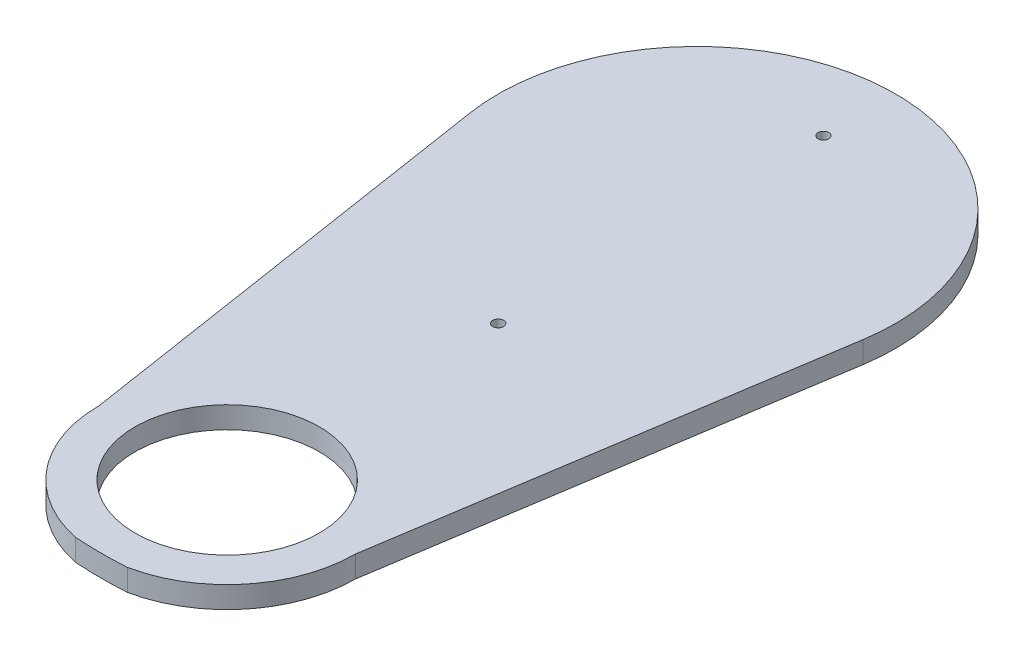
ISO-10303-21;
HEADER;
FILE_DESCRIPTION(('STEP AP214'),'2;1');
FILE_NAME('part.step','',(''),(''),'','','');
FILE_SCHEMA(('AUTOMOTIVE_DESIGN { 1 0 10303 214 1 1 1 1 }'));
ENDSEC;
DATA;
#1=APPLICATION_CONTEXT('core data for automotive mechanical design processes');
#2=APPLICATION_PROTOCOL_DEFINITION('international standard','automotive_design',2000,#1);
#3=PRODUCT_CONTEXT('',#1,'mechanical');
#4=PRODUCT('Part','Part','',(#3));
#5=PRODUCT_RELATED_PRODUCT_CATEGORY('part','',(#4));
#6=PRODUCT_DEFINITION_FORMATION('','',#4);
#7=PRODUCT_DEFINITION_CONTEXT('part definition',#1,'design');
#8=PRODUCT_DEFINITION('design','',#6,#7);
#9=PRODUCT_DEFINITION_SHAPE('','',#8);
#10=(LENGTH_UNIT() NAMED_UNIT(*) SI_UNIT(.MILLI.,.METRE.));
#11=(NAMED_UNIT(*) PLANE_ANGLE_UNIT() SI_UNIT($,.RADIAN.));
#12=(NAMED_UNIT(*) SI_UNIT($,.STERADIAN.) SOLID_ANGLE_UNIT());
#13=UNCERTAINTY_MEASURE_WITH_UNIT(LENGTH_MEASURE(1.E-05),#10,'distance_accuracy_value','');
#14=(GEOMETRIC_REPRESENTATION_CONTEXT(3) GLOBAL_UNCERTAINTY_ASSIGNED_CONTEXT((#13)) GLOBAL_UNIT_ASSIGNED_CONTEXT((#10,
#11,#12)) REPRESENTATION_CONTEXT('',''));
#15=CARTESIAN_POINT('',(0.,0.,0.));
#16=DIRECTION('',(0.,0.,1.));
#17=DIRECTION('',(1.,0.,0.));
#18=AXIS2_PLACEMENT_3D('',#15,#16,#17);
#19=CARTESIAN_POINT('',(0.,6.,0.));
#20=DIRECTION('',(0.,-1.,0.));
#21=DIRECTION('',(0.,0.,-1.));
#22=AXIS2_PLACEMENT_3D('',#19,#20,#21);
#23=CYLINDRICAL_SURFACE('',#22,110.);
#24=DIRECTION('',(0.,1.,0.));
#25=VECTOR('',#24,1.);
#26=CARTESIAN_POINT('',(-7.18642992034292,-4.,109.765));
#27=LINE('',#26,#25);
#28=CARTESIAN_POINT('',(-7.18642992034292,0.,109.765));
#29=VERTEX_POINT('',#28);
#30=CARTESIAN_POINT('',(-7.18642992034292,6.,109.765));
#31=VERTEX_POINT('',#30);
#32=EDGE_CURVE('E126',#29,#31,#27,.T.);
#33=ORIENTED_EDGE('',*,*,#32,.F.);
#34=CARTESIAN_POINT('',(0.,0.,0.));
#35=DIRECTION('',(0.,1.,0.));
#36=DIRECTION('',(0.,0.,1.));
#37=AXIS2_PLACEMENT_3D('',#34,#35,#36);
#38=CIRCLE('',#37,110.);
#39=CARTESIAN_POINT('',(7.18642992034292,0.,109.765));
#40=VERTEX_POINT('',#39);
#41=EDGE_CURVE('E147',#29,#40,#38,.T.);
#42=ORIENTED_EDGE('',*,*,#41,.T.);
#43=DIRECTION('',(0.,1.,0.));
#44=VECTOR('',#43,1.);
#45=CARTESIAN_POINT('',(7.18642992034292,-4.,109.765));
#46=LINE('',#45,#44);
#47=CARTESIAN_POINT('',(7.18642992034292,6.,109.765));
#48=VERTEX_POINT('',#47);
#49=EDGE_CURVE('E144',#40,#48,#46,.T.);
#50=ORIENTED_EDGE('',*,*,#49,.T.);
#51=CARTESIAN_POINT('',(0.,6.,0.));
#52=DIRECTION('',(0.,1.,0.));
#53=DIRECTION('',(0.,0.,1.));
#54=AXIS2_PLACEMENT_3D('',#51,#52,#53);
#55=CIRCLE('',#54,110.);
#56=EDGE_CURVE('E151',#31,#48,#55,.T.);
#57=ORIENTED_EDGE('',*,*,#56,.F.);
#58=EDGE_LOOP('',(#33,#42,#50,#57));
#59=FACE_BOUND('',#58,.T.);
#60=ADVANCED_FACE('F59',(#59),#23,.T.);
#61=CARTESIAN_POINT('',(0.,6.,0.));
#62=DIRECTION('',(0.,1.,0.));
#63=DIRECTION('',(0.,0.,1.));
#64=AXIS2_PLACEMENT_3D('',#61,#62,#63);
#65=PLANE('',#64);
#66=CARTESIAN_POINT('',(0.,6.,-90.));
#67=DIRECTION('',(0.,1.,0.));
#68=DIRECTION('',(0.,0.,1.));
#69=AXIS2_PLACEMENT_3D('',#66,#67,#68);
#70=CIRCLE('',#69,1.5);
#71=CARTESIAN_POINT('',(0.,6.,-88.5));
#72=VERTEX_POINT('',#71);
#73=EDGE_CURVE('E153',#72,#72,#70,.T.);
#74=ORIENTED_EDGE('',*,*,#73,.F.);
#75=EDGE_LOOP('',(#74));
#76=FACE_BOUND('',#75,.T.);
#77=CARTESIAN_POINT('',(0.,6.,0.));
#78=DIRECTION('',(0.,1.,0.));
#79=DIRECTION('',(0.,0.,1.));
#80=AXIS2_PLACEMENT_3D('',#77,#78,#79);
#81=CIRCLE('',#80,1.5);
#82=CARTESIAN_POINT('',(0.,6.,1.5));
#83=VERTEX_POINT('',#82);
#84=EDGE_CURVE('E157',#83,#83,#81,.T.);
#85=ORIENTED_EDGE('',*,*,#84,.F.);
#86=EDGE_LOOP('',(#85));
#87=FACE_BOUND('',#86,.T.);
#88=CARTESIAN_POINT('',(0.,6.,75.));
#89=DIRECTION('',(0.,1.,0.));
#90=DIRECTION('',(0.,0.,1.));
#91=AXIS2_PLACEMENT_3D('',#88,#89,#90);
#92=CIRCLE('',#91,25.5);
#93=CARTESIAN_POINT('',(0.,6.,100.5));
#94=VERTEX_POINT('',#93);
#95=EDGE_CURVE('E160',#94,#94,#92,.T.);
#96=ORIENTED_EDGE('',*,*,#95,.F.);
#97=EDGE_LOOP('',(#96));
#98=FACE_BOUND('',#97,.T.);
#99=DIRECTION('',(-0.153224661677923,0.,-0.988191379770986));
#100=VECTOR('',#99,1.);
#101=CARTESIAN_POINT('',(-46.0226849462896,6.,7.13607756023852));
#102=LINE('',#101,#100);
#103=CARTESIAN_POINT('',(-35.5,6.,75.));
#104=VERTEX_POINT('',#103);
#105=CARTESIAN_POINT('',(-54.3505258874043,6.,-46.5726436077142));
#106=VERTEX_POINT('',#105);
#107=EDGE_CURVE('E116',#104,#106,#102,.T.);
#108=ORIENTED_EDGE('',*,*,#107,.F.);
#109=CARTESIAN_POINT('',(0.,6.,75.));
#110=DIRECTION('',(0.,1.,0.));
#111=DIRECTION('',(0.,0.,1.));
#112=AXIS2_PLACEMENT_3D('',#109,#110,#111);
#113=CIRCLE('',#112,35.5);
#114=EDGE_CURVE('E123',#104,#31,#113,.T.);
#115=ORIENTED_EDGE('',*,*,#114,.T.);
#116=ORIENTED_EDGE('',*,*,#56,.T.);
#117=CARTESIAN_POINT('',(0.,6.,75.));
#118=DIRECTION('',(0.,1.,0.));
#119=DIRECTION('',(0.,0.,1.));
#120=AXIS2_PLACEMENT_3D('',#117,#118,#119);
#121=CIRCLE('',#120,35.5);
#122=CARTESIAN_POINT('',(35.5,6.,75.));
#123=VERTEX_POINT('',#122);
#124=EDGE_CURVE('E137',#48,#123,#121,.T.);
#125=ORIENTED_EDGE('',*,*,#124,.T.);
#126=DIRECTION('',(0.153224661677923,0.,-0.988191379770986));
#127=VECTOR('',#126,1.);
#128=CARTESIAN_POINT('',(46.0226849462896,6.,7.13607756023851));
#129=LINE('',#128,#127);
#130=CARTESIAN_POINT('',(54.3505258874043,6.,-46.5726436077142));
#131=VERTEX_POINT('',#130);
#132=EDGE_CURVE('E142',#123,#131,#129,.T.);
#133=ORIENTED_EDGE('',*,*,#132,.T.);
#134=CARTESIAN_POINT('',(0.,6.,-55.));
#135=DIRECTION('',(0.,1.,0.));
#136=DIRECTION('',(0.,0.,1.));
#137=AXIS2_PLACEMENT_3D('',#134,#135,#136);
#138=CIRCLE('',#137,55.);
#139=EDGE_CURVE('E132',#131,#106,#138,.T.);
#140=ORIENTED_EDGE('',*,*,#139,.T.);
#141=EDGE_LOOP('',(#108,#115,#116,#125,#133,#140));
#142=FACE_BOUND('',#141,.T.);
#143=ADVANCED_FACE('F130',(#76,#87,#98,#142),#65,.T.);
#144=CARTESIAN_POINT('',(0.,0.,0.));
#145=DIRECTION('',(0.,1.,0.));
#146=DIRECTION('',(0.,0.,1.));
#147=AXIS2_PLACEMENT_3D('',#144,#145,#146);
#148=PLANE('',#147);
#149=CARTESIAN_POINT('',(0.,0.,-90.));
#150=DIRECTION('',(0.,1.,0.));
#151=DIRECTION('',(0.,0.,1.));
#152=AXIS2_PLACEMENT_3D('',#149,#150,#151);
#153=CIRCLE('',#152,1.5);
#154=CARTESIAN_POINT('',(0.,0.,-88.5));
#155=VERTEX_POINT('',#154);
#156=EDGE_CURVE('E165',#155,#155,#153,.T.);
#157=ORIENTED_EDGE('',*,*,#156,.T.);
#158=EDGE_LOOP('',(#157));
#159=FACE_BOUND('',#158,.T.);
#160=CARTESIAN_POINT('',(0.,0.,0.));
#161=DIRECTION('',(0.,1.,0.));
#162=DIRECTION('',(0.,0.,1.));
#163=AXIS2_PLACEMENT_3D('',#160,#161,#162);
#164=CIRCLE('',#163,1.5);
#165=CARTESIAN_POINT('',(0.,0.,1.5));
#166=VERTEX_POINT('',#165);
#167=EDGE_CURVE('E168',#166,#166,#164,.T.);
#168=ORIENTED_EDGE('',*,*,#167,.T.);
#169=EDGE_LOOP('',(#168));
#170=FACE_BOUND('',#169,.T.);
#171=CARTESIAN_POINT('',(0.,0.,75.));
#172=DIRECTION('',(0.,1.,0.));
#173=DIRECTION('',(0.,0.,1.));
#174=AXIS2_PLACEMENT_3D('',#171,#172,#173);
#175=CIRCLE('',#174,25.5);
#176=CARTESIAN_POINT('',(0.,0.,100.5));
#177=VERTEX_POINT('',#176);
#178=EDGE_CURVE('E154',#177,#177,#175,.T.);
#179=ORIENTED_EDGE('',*,*,#178,.T.);
#180=EDGE_LOOP('',(#179));
#181=FACE_BOUND('',#180,.T.);
#182=CARTESIAN_POINT('',(0.,0.,75.));
#183=DIRECTION('',(0.,1.,0.));
#184=DIRECTION('',(0.,0.,1.));
#185=AXIS2_PLACEMENT_3D('',#182,#183,#184);
#186=CIRCLE('',#185,35.5);
#187=CARTESIAN_POINT('',(-35.5,0.,75.));
#188=VERTEX_POINT('',#187);
#189=EDGE_CURVE('E12',#188,#29,#186,.T.);
#190=ORIENTED_EDGE('',*,*,#189,.F.);
#191=DIRECTION('',(-0.153224661677923,0.,-0.988191379770986));
#192=VECTOR('',#191,1.);
#193=CARTESIAN_POINT('',(-46.0226849462896,0.,7.13607756023852));
#194=LINE('',#193,#192);
#195=CARTESIAN_POINT('',(-54.3505258874043,0.,-46.5726436077142));
#196=VERTEX_POINT('',#195);
#197=EDGE_CURVE('E66',#188,#196,#194,.T.);
#198=ORIENTED_EDGE('',*,*,#197,.T.);
#199=CARTESIAN_POINT('',(0.,0.,-55.));
#200=DIRECTION('',(0.,1.,0.));
#201=DIRECTION('',(0.,0.,1.));
#202=AXIS2_PLACEMENT_3D('',#199,#200,#201);
#203=CIRCLE('',#202,55.);
#204=CARTESIAN_POINT('',(54.3505258874043,0.,-46.5726436077142));
#205=VERTEX_POINT('',#204);
#206=EDGE_CURVE('E163',#205,#196,#203,.T.);
#207=ORIENTED_EDGE('',*,*,#206,.F.);
#208=DIRECTION('',(0.153224661677923,0.,-0.988191379770986));
#209=VECTOR('',#208,1.);
#210=CARTESIAN_POINT('',(46.0226849462896,0.,7.13607756023851));
#211=LINE('',#210,#209);
#212=CARTESIAN_POINT('',(35.5,0.,75.));
#213=VERTEX_POINT('',#212);
#214=EDGE_CURVE('E174',#213,#205,#211,.T.);
#215=ORIENTED_EDGE('',*,*,#214,.F.);
#216=CARTESIAN_POINT('',(0.,0.,75.));
#217=DIRECTION('',(0.,1.,0.));
#218=DIRECTION('',(0.,0.,1.));
#219=AXIS2_PLACEMENT_3D('',#216,#217,#218);
#220=CIRCLE('',#219,35.5);
#221=EDGE_CURVE('E81',#40,#213,#220,.T.);
#222=ORIENTED_EDGE('',*,*,#221,.F.);
#223=ORIENTED_EDGE('',*,*,#41,.F.);
#224=EDGE_LOOP('',(#190,#198,#207,#215,#222,#223));
#225=FACE_BOUND('',#224,.T.);
#226=ADVANCED_FACE('F178',(#159,#170,#181,#225),#148,.F.);
#227=CARTESIAN_POINT('',(0.,6.,0.));
#228=DIRECTION('',(0.,-1.,0.));
#229=DIRECTION('',(0.,0.,-1.));
#230=AXIS2_PLACEMENT_3D('',#227,#228,#229);
#231=CYLINDRICAL_SURFACE('',#230,1.5);
#232=ORIENTED_EDGE('',*,*,#84,.T.);
#233=EDGE_LOOP('',(#232));
#234=FACE_BOUND('',#233,.T.);
#235=ORIENTED_EDGE('',*,*,#167,.F.);
#236=EDGE_LOOP('',(#235));
#237=FACE_BOUND('',#236,.T.);
#238=ADVANCED_FACE('F206',(#234,#237),#231,.F.);
#239=CARTESIAN_POINT('',(0.,6.,-90.));
#240=DIRECTION('',(0.,-1.,0.));
#241=DIRECTION('',(0.,0.,-1.));
#242=AXIS2_PLACEMENT_3D('',#239,#240,#241);
#243=CYLINDRICAL_SURFACE('',#242,1.5);
#244=ORIENTED_EDGE('',*,*,#73,.T.);
#245=EDGE_LOOP('',(#244));
#246=FACE_BOUND('',#245,.T.);
#247=ORIENTED_EDGE('',*,*,#156,.F.);
#248=EDGE_LOOP('',(#247));
#249=FACE_BOUND('',#248,.T.);
#250=ADVANCED_FACE('F215',(#246,#249),#243,.F.);
#251=CARTESIAN_POINT('',(0.,6.,75.));
#252=DIRECTION('',(0.,-1.,0.));
#253=DIRECTION('',(0.,0.,-1.));
#254=AXIS2_PLACEMENT_3D('',#251,#252,#253);
#255=CYLINDRICAL_SURFACE('',#254,25.5);
#256=ORIENTED_EDGE('',*,*,#95,.T.);
#257=EDGE_LOOP('',(#256));
#258=FACE_BOUND('',#257,.T.);
#259=ORIENTED_EDGE('',*,*,#178,.F.);
#260=EDGE_LOOP('',(#259));
#261=FACE_BOUND('',#260,.T.);
#262=ADVANCED_FACE('F212',(#258,#261),#255,.F.);
#263=CARTESIAN_POINT('',(0.,-4.,75.));
#264=DIRECTION('',(0.,1.,0.));
#265=DIRECTION('',(0.,0.,1.));
#266=AXIS2_PLACEMENT_3D('',#263,#264,#265);
#267=CYLINDRICAL_SURFACE('',#266,35.5);
#268=ORIENTED_EDGE('',*,*,#221,.T.);
#269=DIRECTION('',(0.,1.,0.));
#270=VECTOR('',#269,1.);
#271=CARTESIAN_POINT('',(35.5,-4.,75.));
#272=LINE('',#271,#270);
#273=EDGE_CURVE('E145',#213,#123,#272,.T.);
#274=ORIENTED_EDGE('',*,*,#273,.T.);
#275=ORIENTED_EDGE('',*,*,#124,.F.);
#276=ORIENTED_EDGE('',*,*,#49,.F.);
#277=EDGE_LOOP('',(#268,#274,#275,#276));
#278=FACE_BOUND('',#277,.T.);
#279=ADVANCED_FACE('F183',(#278),#267,.T.);
#280=CARTESIAN_POINT('',(46.0226849462896,-4.,7.13607756023851));
#281=DIRECTION('',(0.988191379770986,0.,0.153224661677923));
#282=DIRECTION('',(0.153224661677923,0.,-0.988191379770986));
#283=AXIS2_PLACEMENT_3D('',#280,#281,#282);
#284=PLANE('',#283);
#285=ORIENTED_EDGE('',*,*,#214,.T.);
#286=DIRECTION('',(0.,1.,0.));
#287=VECTOR('',#286,1.);
#288=CARTESIAN_POINT('',(54.3505258874043,-4.,-46.5726436077142));
#289=LINE('',#288,#287);
#290=EDGE_CURVE('E73',#205,#131,#289,.T.);
#291=ORIENTED_EDGE('',*,*,#290,.T.);
#292=ORIENTED_EDGE('',*,*,#132,.F.);
#293=ORIENTED_EDGE('',*,*,#273,.F.);
#294=EDGE_LOOP('',(#285,#291,#292,#293));
#295=FACE_BOUND('',#294,.T.);
#296=ADVANCED_FACE('F186',(#295),#284,.T.);
#297=CARTESIAN_POINT('',(0.,-4.,-55.));
#298=DIRECTION('',(0.,1.,0.));
#299=DIRECTION('',(0.,0.,1.));
#300=AXIS2_PLACEMENT_3D('',#297,#298,#299);
#301=CYLINDRICAL_SURFACE('',#300,55.);
#302=ORIENTED_EDGE('',*,*,#206,.T.);
#303=DIRECTION('',(0.,1.,0.));
#304=VECTOR('',#303,1.);
#305=CARTESIAN_POINT('',(-54.3505258874043,-4.,-46.5726436077142));
#306=LINE('',#305,#304);
#307=EDGE_CURVE('E120',#196,#106,#306,.T.);
#308=ORIENTED_EDGE('',*,*,#307,.T.);
#309=ORIENTED_EDGE('',*,*,#139,.F.);
#310=ORIENTED_EDGE('',*,*,#290,.F.);
#311=EDGE_LOOP('',(#302,#308,#309,#310));
#312=FACE_BOUND('',#311,.T.);
#313=ADVANCED_FACE('F187',(#312),#301,.T.);
#314=CARTESIAN_POINT('',(0.,-4.,75.));
#315=DIRECTION('',(0.,1.,0.));
#316=DIRECTION('',(0.,0.,1.));
#317=AXIS2_PLACEMENT_3D('',#314,#315,#316);
#318=CYLINDRICAL_SURFACE('',#317,35.5);
#319=ORIENTED_EDGE('',*,*,#189,.T.);
#320=ORIENTED_EDGE('',*,*,#32,.T.);
#321=ORIENTED_EDGE('',*,*,#114,.F.);
#322=DIRECTION('',(0.,1.,0.));
#323=VECTOR('',#322,1.);
#324=CARTESIAN_POINT('',(-35.5,-4.,75.));
#325=LINE('',#324,#323);
#326=EDGE_CURVE('E111',#188,#104,#325,.T.);
#327=ORIENTED_EDGE('',*,*,#326,.F.);
#328=EDGE_LOOP('',(#319,#320,#321,#327));
#329=FACE_BOUND('',#328,.T.);
#330=ADVANCED_FACE('F124',(#329),#318,.T.);
#331=CARTESIAN_POINT('',(-46.0226849462896,-4.,7.13607756023852));
#332=DIRECTION('',(0.988191379770986,0.,-0.153224661677923));
#333=DIRECTION('',(-0.153224661677923,0.,-0.988191379770986));
#334=AXIS2_PLACEMENT_3D('',#331,#332,#333);
#335=PLANE('',#334);
#336=ORIENTED_EDGE('',*,*,#326,.T.);
#337=ORIENTED_EDGE('',*,*,#107,.T.);
#338=ORIENTED_EDGE('',*,*,#307,.F.);
#339=ORIENTED_EDGE('',*,*,#197,.F.);
#340=EDGE_LOOP('',(#336,#337,#338,#339));
#341=FACE_BOUND('',#340,.T.);
#342=ADVANCED_FACE('F113',(#341),#335,.F.);
#343=CLOSED_SHELL('',(#60,#143,#226,#238,#250,#262,#279,#296,#313,#330,#342));
#344=MANIFOLD_SOLID_BREP('B2',#343);
#345=ADVANCED_BREP_SHAPE_REPRESENTATION('',(#18,#344),#14);
#346=SHAPE_DEFINITION_REPRESENTATION(#9,#345);
ENDSEC;
END-ISO-10303-21;
